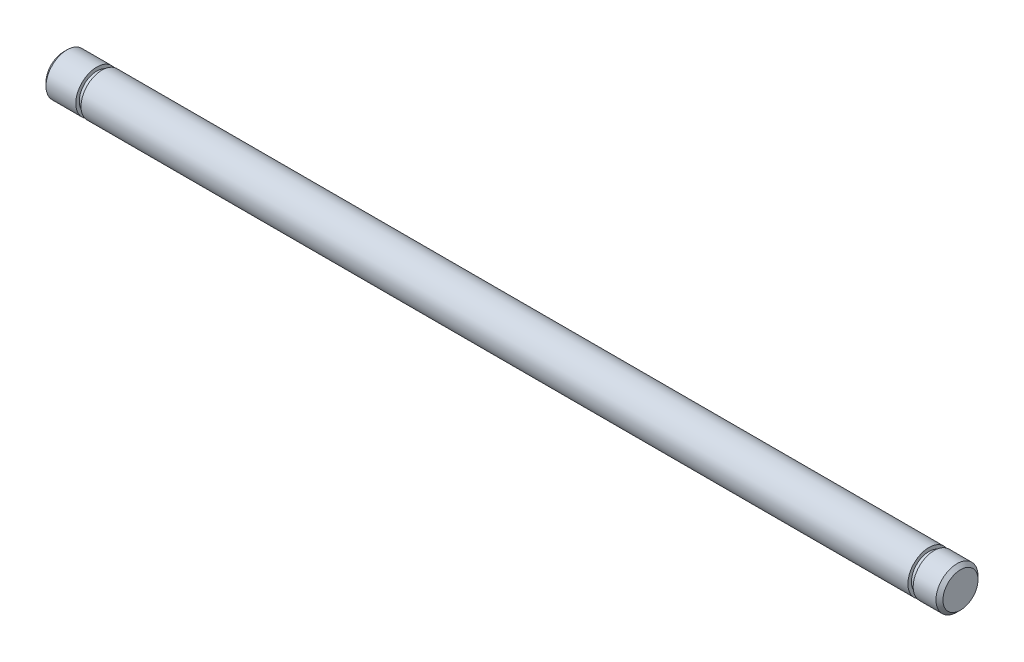
ISO-10303-21;
HEADER;
FILE_DESCRIPTION(('STEP AP214'),'2;1');
FILE_NAME('part.step','',(''),(''),'','','');
FILE_SCHEMA(('AUTOMOTIVE_DESIGN { 1 0 10303 214 1 1 1 1 }'));
ENDSEC;
DATA;
#1=APPLICATION_CONTEXT('core data for automotive mechanical design processes');
#2=APPLICATION_PROTOCOL_DEFINITION('international standard','automotive_design',2000,#1);
#3=PRODUCT_CONTEXT('',#1,'mechanical');
#4=PRODUCT('Part','Part','',(#3));
#5=PRODUCT_RELATED_PRODUCT_CATEGORY('part','',(#4));
#6=PRODUCT_DEFINITION_FORMATION('','',#4);
#7=PRODUCT_DEFINITION_CONTEXT('part definition',#1,'design');
#8=PRODUCT_DEFINITION('design','',#6,#7);
#9=PRODUCT_DEFINITION_SHAPE('','',#8);
#10=(LENGTH_UNIT() NAMED_UNIT(*) SI_UNIT(.MILLI.,.METRE.));
#11=(NAMED_UNIT(*) PLANE_ANGLE_UNIT() SI_UNIT($,.RADIAN.));
#12=(NAMED_UNIT(*) SI_UNIT($,.STERADIAN.) SOLID_ANGLE_UNIT());
#13=UNCERTAINTY_MEASURE_WITH_UNIT(LENGTH_MEASURE(1.E-05),#10,'distance_accuracy_value','');
#14=(GEOMETRIC_REPRESENTATION_CONTEXT(3) GLOBAL_UNCERTAINTY_ASSIGNED_CONTEXT((#13)) GLOBAL_UNIT_ASSIGNED_CONTEXT((#10,
#11,#12)) REPRESENTATION_CONTEXT('',''));
#15=CARTESIAN_POINT('',(0.,0.,0.));
#16=DIRECTION('',(0.,0.,1.));
#17=DIRECTION('',(1.,0.,0.));
#18=AXIS2_PLACEMENT_3D('',#15,#16,#17);
#19=CARTESIAN_POINT('',(0.,1.5,0.));
#20=DIRECTION('',(1.,0.,0.));
#21=DIRECTION('',(0.,0.,-1.));
#22=AXIS2_PLACEMENT_3D('',#19,#20,#21);
#23=PLANE('',#22);
#24=CARTESIAN_POINT('',(2.2737335018258E-10,0.,0.));
#25=DIRECTION('',(-1.,0.,0.));
#26=DIRECTION('',(0.,-1.,0.));
#27=AXIS2_PLACEMENT_3D('',#24,#25,#26);
#28=CIRCLE('',#27,2.5000000002251);
#29=CARTESIAN_POINT('',(2.27373621233123E-10,-2.5000000002251,0.));
#30=VERTEX_POINT('',#29);
#31=EDGE_CURVE('E18',#30,#30,#28,.T.);
#32=ORIENTED_EDGE('',*,*,#31,.F.);
#33=EDGE_LOOP('',(#32));
#34=FACE_BOUND('',#33,.T.);
#35=ADVANCED_FACE('F15',(#34),#23,.T.);
#36=CARTESIAN_POINT('',(-128.,1.49999999999998,0.));
#37=DIRECTION('',(-1.,0.,0.));
#38=DIRECTION('',(0.,0.,1.));
#39=AXIS2_PLACEMENT_3D('',#36,#37,#38);
#40=PLANE('',#39);
#41=CARTESIAN_POINT('',(-128.000000000213,0.,0.));
#42=DIRECTION('',(1.,0.,0.));
#43=DIRECTION('',(0.,0.,-1.));
#44=AXIS2_PLACEMENT_3D('',#41,#42,#43);
#45=CIRCLE('',#44,2.50000000022508);
#46=CARTESIAN_POINT('',(-128.000000000213,0.,-2.50000000022508));
#47=VERTEX_POINT('',#46);
#48=EDGE_CURVE('E50',#47,#47,#45,.T.);
#49=ORIENTED_EDGE('',*,*,#48,.F.);
#50=EDGE_LOOP('',(#49));
#51=FACE_BOUND('',#50,.T.);
#52=ADVANCED_FACE('F63',(#51),#40,.T.);
#53=CARTESIAN_POINT('',(-0.500000000215551,0.,0.));
#54=DIRECTION('',(-1.,0.,0.));
#55=DIRECTION('',(0.,-1.,0.));
#56=AXIS2_PLACEMENT_3D('',#53,#54,#55);
#57=CONICAL_SURFACE('',#56,2.99999999975853,0.785398162487954);
#58=ORIENTED_EDGE('',*,*,#31,.T.);
#59=EDGE_LOOP('',(#58));
#60=FACE_BOUND('',#59,.T.);
#61=CARTESIAN_POINT('',(-0.5,0.,0.));
#62=DIRECTION('',(1.,0.,0.));
#63=DIRECTION('',(0.,1.,0.));
#64=AXIS2_PLACEMENT_3D('',#61,#62,#63);
#65=CIRCLE('',#64,3.);
#66=CARTESIAN_POINT('',(-0.5,3.,0.));
#67=VERTEX_POINT('',#66);
#68=EDGE_CURVE('E52',#67,#67,#65,.F.);
#69=ORIENTED_EDGE('',*,*,#68,.F.);
#70=EDGE_LOOP('',(#69));
#71=FACE_BOUND('',#70,.T.);
#72=ADVANCED_FACE('F59',(#60,#71),#57,.T.);
#73=CARTESIAN_POINT('',(-127.49999999977,0.,0.));
#74=DIRECTION('',(1.,0.,0.));
#75=DIRECTION('',(0.,0.,-1.));
#76=AXIS2_PLACEMENT_3D('',#73,#74,#75);
#77=CONICAL_SURFACE('',#76,2.99999999975851,0.785398162487954);
#78=CARTESIAN_POINT('',(-127.5,0.,0.));
#79=DIRECTION('',(1.,0.,0.));
#80=DIRECTION('',(0.,1.,0.));
#81=AXIS2_PLACEMENT_3D('',#78,#79,#80);
#82=CIRCLE('',#81,2.99999999999998);
#83=CARTESIAN_POINT('',(-127.5,2.99999999999997,0.));
#84=VERTEX_POINT('',#83);
#85=EDGE_CURVE('E49',#84,#84,#82,.T.);
#86=ORIENTED_EDGE('',*,*,#85,.F.);
#87=EDGE_LOOP('',(#86));
#88=FACE_BOUND('',#87,.T.);
#89=ORIENTED_EDGE('',*,*,#48,.T.);
#90=EDGE_LOOP('',(#89));
#91=FACE_BOUND('',#90,.T.);
#92=ADVANCED_FACE('F107',(#88,#91),#77,.T.);
#93=CARTESIAN_POINT('',(-1.875,0.,0.));
#94=DIRECTION('',(1.,0.,0.));
#95=DIRECTION('',(0.,1.,0.));
#96=AXIS2_PLACEMENT_3D('',#93,#94,#95);
#97=CYLINDRICAL_SURFACE('',#96,3.);
#98=ORIENTED_EDGE('',*,*,#68,.T.);
#99=EDGE_LOOP('',(#98));
#100=FACE_BOUND('',#99,.T.);
#101=CARTESIAN_POINT('',(-3.75,0.,0.));
#102=DIRECTION('',(1.,0.,0.));
#103=DIRECTION('',(0.,1.,0.));
#104=AXIS2_PLACEMENT_3D('',#101,#102,#103);
#105=CIRCLE('',#104,3.);
#106=CARTESIAN_POINT('',(-3.75,3.,0.));
#107=VERTEX_POINT('',#106);
#108=EDGE_CURVE('E47',#107,#107,#105,.F.);
#109=ORIENTED_EDGE('',*,*,#108,.F.);
#110=EDGE_LOOP('',(#109));
#111=FACE_BOUND('',#110,.T.);
#112=ADVANCED_FACE('F103',(#100,#111),#97,.T.);
#113=CARTESIAN_POINT('',(-125.625,0.,0.));
#114=DIRECTION('',(1.,0.,0.));
#115=DIRECTION('',(0.,1.,0.));
#116=AXIS2_PLACEMENT_3D('',#113,#114,#115);
#117=CYLINDRICAL_SURFACE('',#116,2.99999999999998);
#118=ORIENTED_EDGE('',*,*,#85,.T.);
#119=EDGE_LOOP('',(#118));
#120=FACE_BOUND('',#119,.T.);
#121=CARTESIAN_POINT('',(-123.25,0.,0.));
#122=DIRECTION('',(1.,0.,0.));
#123=DIRECTION('',(0.,1.,0.));
#124=AXIS2_PLACEMENT_3D('',#121,#122,#123);
#125=CIRCLE('',#124,2.99999999999998);
#126=CARTESIAN_POINT('',(-123.25,2.99999999999997,0.));
#127=VERTEX_POINT('',#126);
#128=EDGE_CURVE('E44',#127,#127,#125,.T.);
#129=ORIENTED_EDGE('',*,*,#128,.F.);
#130=EDGE_LOOP('',(#129));
#131=FACE_BOUND('',#130,.T.);
#132=ADVANCED_FACE('F99',(#120,#131),#117,.T.);
#133=CARTESIAN_POINT('',(-3.75,2.75000000000004,0.));
#134=DIRECTION('',(-1.,0.,0.));
#135=DIRECTION('',(0.,0.,1.));
#136=AXIS2_PLACEMENT_3D('',#133,#134,#135);
#137=PLANE('',#136);
#138=CARTESIAN_POINT('',(-3.75,0.,0.));
#139=DIRECTION('',(1.,0.,0.));
#140=DIRECTION('',(0.,1.,0.));
#141=AXIS2_PLACEMENT_3D('',#138,#139,#140);
#142=CIRCLE('',#141,2.50000000000008);
#143=CARTESIAN_POINT('',(-3.75,2.50000000000008,0.));
#144=VERTEX_POINT('',#143);
#145=EDGE_CURVE('E41',#144,#144,#142,.F.);
#146=ORIENTED_EDGE('',*,*,#145,.F.);
#147=EDGE_LOOP('',(#146));
#148=FACE_BOUND('',#147,.T.);
#149=ORIENTED_EDGE('',*,*,#108,.T.);
#150=EDGE_LOOP('',(#149));
#151=FACE_BOUND('',#150,.T.);
#152=ADVANCED_FACE('F95',(#148,#151),#137,.T.);
#153=CARTESIAN_POINT('',(-123.25,2.74999999999997,0.));
#154=DIRECTION('',(1.,0.,0.));
#155=DIRECTION('',(0.,0.,-1.));
#156=AXIS2_PLACEMENT_3D('',#153,#154,#155);
#157=PLANE('',#156);
#158=CARTESIAN_POINT('',(-123.25,0.,0.));
#159=DIRECTION('',(1.,0.,0.));
#160=DIRECTION('',(0.,1.,0.));
#161=AXIS2_PLACEMENT_3D('',#158,#159,#160);
#162=CIRCLE('',#161,2.49999999999999);
#163=CARTESIAN_POINT('',(-123.25,2.49999999999998,0.));
#164=VERTEX_POINT('',#163);
#165=EDGE_CURVE('E38',#164,#164,#162,.T.);
#166=ORIENTED_EDGE('',*,*,#165,.F.);
#167=EDGE_LOOP('',(#166));
#168=FACE_BOUND('',#167,.T.);
#169=ORIENTED_EDGE('',*,*,#128,.T.);
#170=EDGE_LOOP('',(#169));
#171=FACE_BOUND('',#170,.T.);
#172=ADVANCED_FACE('F91',(#168,#171),#157,.T.);
#173=CARTESIAN_POINT('',(-4.125,0.,0.));
#174=DIRECTION('',(1.,0.,0.));
#175=DIRECTION('',(0.,1.,0.));
#176=AXIS2_PLACEMENT_3D('',#173,#174,#175);
#177=CYLINDRICAL_SURFACE('',#176,2.50000000000008);
#178=CARTESIAN_POINT('',(-4.5,0.,0.));
#179=DIRECTION('',(1.,0.,0.));
#180=DIRECTION('',(0.,1.,0.));
#181=AXIS2_PLACEMENT_3D('',#178,#179,#180);
#182=CIRCLE('',#181,2.50000000000008);
#183=CARTESIAN_POINT('',(-4.5,2.50000000000008,0.));
#184=VERTEX_POINT('',#183);
#185=EDGE_CURVE('E35',#184,#184,#182,.F.);
#186=ORIENTED_EDGE('',*,*,#185,.F.);
#187=EDGE_LOOP('',(#186));
#188=FACE_BOUND('',#187,.T.);
#189=ORIENTED_EDGE('',*,*,#145,.T.);
#190=EDGE_LOOP('',(#189));
#191=FACE_BOUND('',#190,.T.);
#192=ADVANCED_FACE('F87',(#188,#191),#177,.T.);
#193=CARTESIAN_POINT('',(-122.875,0.,0.));
#194=DIRECTION('',(1.,0.,0.));
#195=DIRECTION('',(0.,1.,0.));
#196=AXIS2_PLACEMENT_3D('',#193,#194,#195);
#197=CYLINDRICAL_SURFACE('',#196,2.49999999999999);
#198=ORIENTED_EDGE('',*,*,#165,.T.);
#199=EDGE_LOOP('',(#198));
#200=FACE_BOUND('',#199,.T.);
#201=CARTESIAN_POINT('',(-122.5,0.,0.));
#202=DIRECTION('',(1.,0.,0.));
#203=DIRECTION('',(0.,1.,0.));
#204=AXIS2_PLACEMENT_3D('',#201,#202,#203);
#205=CIRCLE('',#204,2.49999999999999);
#206=CARTESIAN_POINT('',(-122.5,2.49999999999998,0.));
#207=VERTEX_POINT('',#206);
#208=EDGE_CURVE('E27',#207,#207,#205,.T.);
#209=ORIENTED_EDGE('',*,*,#208,.F.);
#210=EDGE_LOOP('',(#209));
#211=FACE_BOUND('',#210,.T.);
#212=ADVANCED_FACE('F83',(#200,#211),#197,.T.);
#213=CARTESIAN_POINT('',(-4.5,2.75000000000004,0.));
#214=DIRECTION('',(1.,0.,0.));
#215=DIRECTION('',(0.,0.,-1.));
#216=AXIS2_PLACEMENT_3D('',#213,#214,#215);
#217=PLANE('',#216);
#218=ORIENTED_EDGE('',*,*,#185,.T.);
#219=EDGE_LOOP('',(#218));
#220=FACE_BOUND('',#219,.T.);
#221=CARTESIAN_POINT('',(-4.5,0.,0.));
#222=DIRECTION('',(1.,0.,0.));
#223=DIRECTION('',(0.,1.,0.));
#224=AXIS2_PLACEMENT_3D('',#221,#222,#223);
#225=CIRCLE('',#224,2.99999999999999);
#226=CARTESIAN_POINT('',(-4.5,2.99999999999999,0.));
#227=VERTEX_POINT('',#226);
#228=EDGE_CURVE('E22',#227,#227,#225,.F.);
#229=ORIENTED_EDGE('',*,*,#228,.F.);
#230=EDGE_LOOP('',(#229));
#231=FACE_BOUND('',#230,.T.);
#232=ADVANCED_FACE('F76',(#220,#231),#217,.T.);
#233=CARTESIAN_POINT('',(-122.5,2.74999999999997,0.));
#234=DIRECTION('',(-1.,0.,0.));
#235=DIRECTION('',(0.,0.,1.));
#236=AXIS2_PLACEMENT_3D('',#233,#234,#235);
#237=PLANE('',#236);
#238=ORIENTED_EDGE('',*,*,#208,.T.);
#239=EDGE_LOOP('',(#238));
#240=FACE_BOUND('',#239,.T.);
#241=CARTESIAN_POINT('',(-122.5,0.,0.));
#242=DIRECTION('',(1.,0.,0.));
#243=DIRECTION('',(0.,1.,0.));
#244=AXIS2_PLACEMENT_3D('',#241,#242,#243);
#245=CIRCLE('',#244,2.99999999999999);
#246=CARTESIAN_POINT('',(-122.5,2.99999999999998,0.));
#247=VERTEX_POINT('',#246);
#248=EDGE_CURVE('E10',#247,#247,#245,.T.);
#249=ORIENTED_EDGE('',*,*,#248,.F.);
#250=EDGE_LOOP('',(#249));
#251=FACE_BOUND('',#250,.T.);
#252=ADVANCED_FACE('F71',(#240,#251),#237,.T.);
#253=CARTESIAN_POINT('',(-63.5,0.,0.));
#254=DIRECTION('',(1.,0.,0.));
#255=DIRECTION('',(0.,1.,0.));
#256=AXIS2_PLACEMENT_3D('',#253,#254,#255);
#257=CYLINDRICAL_SURFACE('',#256,2.99999999999999);
#258=ORIENTED_EDGE('',*,*,#248,.T.);
#259=EDGE_LOOP('',(#258));
#260=FACE_BOUND('',#259,.T.);
#261=ORIENTED_EDGE('',*,*,#228,.T.);
#262=EDGE_LOOP('',(#261));
#263=FACE_BOUND('',#262,.T.);
#264=ADVANCED_FACE('F69',(#260,#263),#257,.T.);
#265=CLOSED_SHELL('',(#35,#52,#72,#92,#112,#132,#152,#172,#192,#212,#232,#252,#264));
#266=MANIFOLD_SOLID_BREP('B1',#265);
#267=ADVANCED_BREP_SHAPE_REPRESENTATION('',(#18,#266),#14);
#268=SHAPE_DEFINITION_REPRESENTATION(#9,#267);
ENDSEC;
END-ISO-10303-21;
